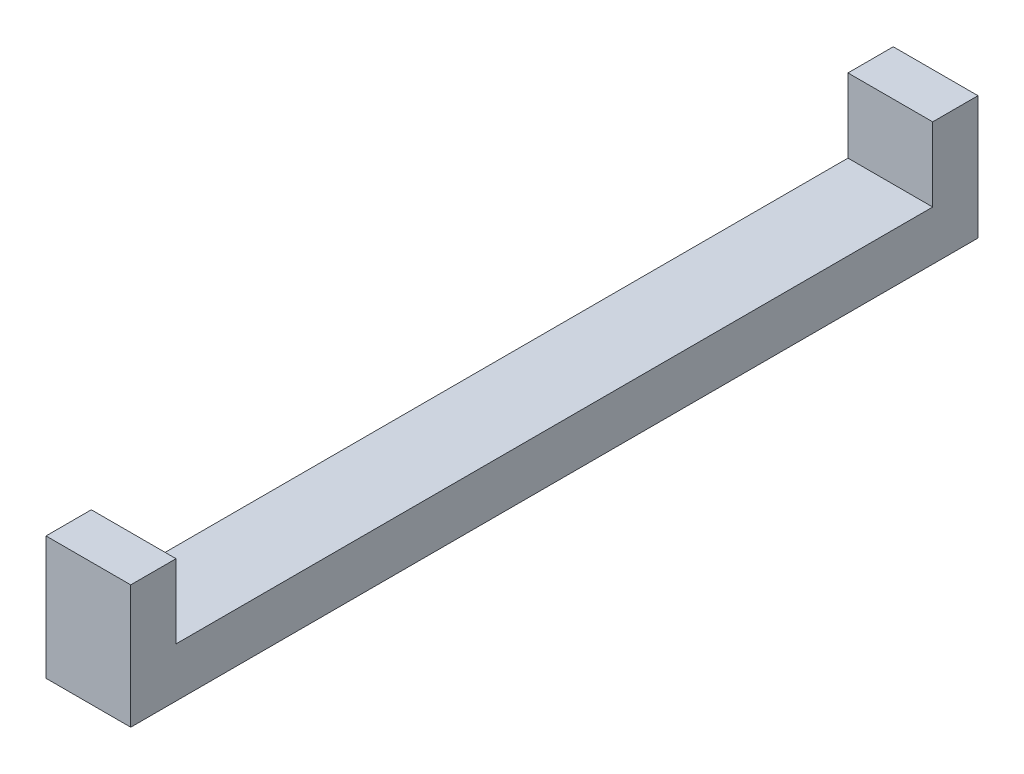
ISO-10303-21;
HEADER;
FILE_DESCRIPTION(('STEP AP214'),'2;1');
FILE_NAME('part.step','',(''),(''),'','','');
FILE_SCHEMA(('AUTOMOTIVE_DESIGN { 1 0 10303 214 1 1 1 1 }'));
ENDSEC;
DATA;
#1=APPLICATION_CONTEXT('core data for automotive mechanical design processes');
#2=APPLICATION_PROTOCOL_DEFINITION('international standard','automotive_design',2000,#1);
#3=PRODUCT_CONTEXT('',#1,'mechanical');
#4=PRODUCT('Part','Part','',(#3));
#5=PRODUCT_RELATED_PRODUCT_CATEGORY('part','',(#4));
#6=PRODUCT_DEFINITION_FORMATION('','',#4);
#7=PRODUCT_DEFINITION_CONTEXT('part definition',#1,'design');
#8=PRODUCT_DEFINITION('design','',#6,#7);
#9=PRODUCT_DEFINITION_SHAPE('','',#8);
#10=(LENGTH_UNIT() NAMED_UNIT(*) SI_UNIT(.MILLI.,.METRE.));
#11=(NAMED_UNIT(*) PLANE_ANGLE_UNIT() SI_UNIT($,.RADIAN.));
#12=(NAMED_UNIT(*) SI_UNIT($,.STERADIAN.) SOLID_ANGLE_UNIT());
#13=UNCERTAINTY_MEASURE_WITH_UNIT(LENGTH_MEASURE(1.E-05),#10,'distance_accuracy_value','');
#14=(GEOMETRIC_REPRESENTATION_CONTEXT(3) GLOBAL_UNCERTAINTY_ASSIGNED_CONTEXT((#13)) GLOBAL_UNIT_ASSIGNED_CONTEXT((#10,
#11,#12)) REPRESENTATION_CONTEXT('',''));
#15=CARTESIAN_POINT('',(0.,0.,0.));
#16=DIRECTION('',(0.,0.,1.));
#17=DIRECTION('',(1.,0.,0.));
#18=AXIS2_PLACEMENT_3D('',#15,#16,#17);
#19=CARTESIAN_POINT('',(5.,0.,50.));
#20=DIRECTION('',(0.,0.,-1.));
#21=DIRECTION('',(-1.,0.,0.));
#22=AXIS2_PLACEMENT_3D('',#19,#20,#21);
#23=PLANE('',#22);
#24=DIRECTION('',(0.,-1.,0.));
#25=VECTOR('',#24,1.);
#26=CARTESIAN_POINT('',(-5.,0.,50.));
#27=LINE('',#26,#25);
#28=CARTESIAN_POINT('',(-5.,14.5558924524075,50.));
#29=VERTEX_POINT('',#28);
#30=CARTESIAN_POINT('',(-5.,0.,50.));
#31=VERTEX_POINT('',#30);
#32=EDGE_CURVE('E140',#29,#31,#27,.T.);
#33=ORIENTED_EDGE('',*,*,#32,.T.);
#34=DIRECTION('',(-1.,0.,0.));
#35=VECTOR('',#34,1.);
#36=CARTESIAN_POINT('',(5.,0.,50.));
#37=LINE('',#36,#35);
#38=CARTESIAN_POINT('',(5.,0.,50.));
#39=VERTEX_POINT('',#38);
#40=EDGE_CURVE('E11',#39,#31,#37,.T.);
#41=ORIENTED_EDGE('',*,*,#40,.F.);
#42=DIRECTION('',(0.,-1.,0.));
#43=VECTOR('',#42,1.);
#44=CARTESIAN_POINT('',(5.,0.,50.));
#45=LINE('',#44,#43);
#46=CARTESIAN_POINT('',(5.,14.5558924524075,50.));
#47=VERTEX_POINT('',#46);
#48=EDGE_CURVE('E162',#47,#39,#45,.T.);
#49=ORIENTED_EDGE('',*,*,#48,.F.);
#50=DIRECTION('',(-1.,0.,0.));
#51=VECTOR('',#50,1.);
#52=CARTESIAN_POINT('',(5.,14.5558924524075,50.));
#53=LINE('',#52,#51);
#54=EDGE_CURVE('E136',#47,#29,#53,.T.);
#55=ORIENTED_EDGE('',*,*,#54,.T.);
#56=EDGE_LOOP('',(#33,#41,#49,#55));
#57=FACE_BOUND('',#56,.T.);
#58=ADVANCED_FACE('F39',(#57),#23,.F.);
#59=CARTESIAN_POINT('',(5.,0.,-50.));
#60=DIRECTION('',(0.,1.,0.));
#61=DIRECTION('',(0.,0.,1.));
#62=AXIS2_PLACEMENT_3D('',#59,#60,#61);
#63=PLANE('',#62);
#64=DIRECTION('',(0.,0.,-1.));
#65=VECTOR('',#64,1.);
#66=CARTESIAN_POINT('',(-5.,0.,-50.));
#67=LINE('',#66,#65);
#68=CARTESIAN_POINT('',(-5.,0.,-50.));
#69=VERTEX_POINT('',#68);
#70=EDGE_CURVE('E144',#31,#69,#67,.T.);
#71=ORIENTED_EDGE('',*,*,#70,.T.);
#72=DIRECTION('',(-1.,0.,0.));
#73=VECTOR('',#72,1.);
#74=CARTESIAN_POINT('',(5.,0.,-50.));
#75=LINE('',#74,#73);
#76=CARTESIAN_POINT('',(5.,0.,-50.));
#77=VERTEX_POINT('',#76);
#78=EDGE_CURVE('E48',#77,#69,#75,.T.);
#79=ORIENTED_EDGE('',*,*,#78,.F.);
#80=DIRECTION('',(0.,0.,-1.));
#81=VECTOR('',#80,1.);
#82=CARTESIAN_POINT('',(5.,0.,-50.));
#83=LINE('',#82,#81);
#84=EDGE_CURVE('E99',#39,#77,#83,.T.);
#85=ORIENTED_EDGE('',*,*,#84,.F.);
#86=ORIENTED_EDGE('',*,*,#40,.T.);
#87=EDGE_LOOP('',(#71,#79,#85,#86));
#88=FACE_BOUND('',#87,.T.);
#89=ADVANCED_FACE('F208',(#88),#63,.F.);
#90=CARTESIAN_POINT('',(5.,0.,-50.));
#91=DIRECTION('',(0.,0.,1.));
#92=DIRECTION('',(1.,0.,0.));
#93=AXIS2_PLACEMENT_3D('',#90,#91,#92);
#94=PLANE('',#93);
#95=DIRECTION('',(0.,1.,0.));
#96=VECTOR('',#95,1.);
#97=CARTESIAN_POINT('',(-5.,0.,-50.));
#98=LINE('',#97,#96);
#99=CARTESIAN_POINT('',(-5.,14.5558924524075,-50.));
#100=VERTEX_POINT('',#99);
#101=EDGE_CURVE('E147',#69,#100,#98,.T.);
#102=ORIENTED_EDGE('',*,*,#101,.T.);
#103=DIRECTION('',(-1.,0.,0.));
#104=VECTOR('',#103,1.);
#105=CARTESIAN_POINT('',(5.,14.5558924524075,-50.));
#106=LINE('',#105,#104);
#107=CARTESIAN_POINT('',(5.,14.5558924524075,-50.));
#108=VERTEX_POINT('',#107);
#109=EDGE_CURVE('E173',#108,#100,#106,.T.);
#110=ORIENTED_EDGE('',*,*,#109,.F.);
#111=DIRECTION('',(0.,1.,0.));
#112=VECTOR('',#111,1.);
#113=CARTESIAN_POINT('',(5.,0.,-50.));
#114=LINE('',#113,#112);
#115=EDGE_CURVE('E183',#77,#108,#114,.T.);
#116=ORIENTED_EDGE('',*,*,#115,.F.);
#117=ORIENTED_EDGE('',*,*,#78,.T.);
#118=EDGE_LOOP('',(#102,#110,#116,#117));
#119=FACE_BOUND('',#118,.T.);
#120=ADVANCED_FACE('F181',(#119),#94,.F.);
#121=CARTESIAN_POINT('',(5.,14.5558924524075,-50.));
#122=DIRECTION('',(0.,-1.,0.));
#123=DIRECTION('',(0.,0.,-1.));
#124=AXIS2_PLACEMENT_3D('',#121,#122,#123);
#125=PLANE('',#124);
#126=DIRECTION('',(0.,0.,1.));
#127=VECTOR('',#126,1.);
#128=CARTESIAN_POINT('',(-5.,14.5558924524075,-50.));
#129=LINE('',#128,#127);
#130=CARTESIAN_POINT('',(-5.,14.5558924524075,-44.6521462677769));
#131=VERTEX_POINT('',#130);
#132=EDGE_CURVE('E150',#100,#131,#129,.T.);
#133=ORIENTED_EDGE('',*,*,#132,.T.);
#134=DIRECTION('',(-1.,0.,0.));
#135=VECTOR('',#134,1.);
#136=CARTESIAN_POINT('',(5.,14.5558924524075,-44.6521462677769));
#137=LINE('',#136,#135);
#138=CARTESIAN_POINT('',(5.,14.5558924524075,-44.6521462677769));
#139=VERTEX_POINT('',#138);
#140=EDGE_CURVE('E169',#139,#131,#137,.T.);
#141=ORIENTED_EDGE('',*,*,#140,.F.);
#142=DIRECTION('',(0.,0.,1.));
#143=VECTOR('',#142,1.);
#144=CARTESIAN_POINT('',(5.,14.5558924524075,-50.));
#145=LINE('',#144,#143);
#146=EDGE_CURVE('E196',#108,#139,#145,.T.);
#147=ORIENTED_EDGE('',*,*,#146,.F.);
#148=ORIENTED_EDGE('',*,*,#109,.T.);
#149=EDGE_LOOP('',(#133,#141,#147,#148));
#150=FACE_BOUND('',#149,.T.);
#151=ADVANCED_FACE('F191',(#150),#125,.F.);
#152=CARTESIAN_POINT('',(5.,14.5558924524075,-44.6521462677769));
#153=DIRECTION('',(0.,0.,-1.));
#154=DIRECTION('',(-1.,0.,0.));
#155=AXIS2_PLACEMENT_3D('',#152,#153,#154);
#156=PLANE('',#155);
#157=DIRECTION('',(0.,-1.,0.));
#158=VECTOR('',#157,1.);
#159=CARTESIAN_POINT('',(-5.,14.5558924524075,-44.6521462677769));
#160=LINE('',#159,#158);
#161=CARTESIAN_POINT('',(-5.,5.84685792132524,-44.6521462677769));
#162=VERTEX_POINT('',#161);
#163=EDGE_CURVE('E153',#131,#162,#160,.T.);
#164=ORIENTED_EDGE('',*,*,#163,.T.);
#165=DIRECTION('',(-1.,0.,0.));
#166=VECTOR('',#165,1.);
#167=CARTESIAN_POINT('',(5.,5.84685792132524,-44.6521462677769));
#168=LINE('',#167,#166);
#169=CARTESIAN_POINT('',(5.,5.84685792132524,-44.6521462677769));
#170=VERTEX_POINT('',#169);
#171=EDGE_CURVE('E129',#170,#162,#168,.T.);
#172=ORIENTED_EDGE('',*,*,#171,.F.);
#173=DIRECTION('',(0.,-1.,0.));
#174=VECTOR('',#173,1.);
#175=CARTESIAN_POINT('',(5.,14.5558924524075,-44.6521462677769));
#176=LINE('',#175,#174);
#177=EDGE_CURVE('E118',#139,#170,#176,.T.);
#178=ORIENTED_EDGE('',*,*,#177,.F.);
#179=ORIENTED_EDGE('',*,*,#140,.T.);
#180=EDGE_LOOP('',(#164,#172,#178,#179));
#181=FACE_BOUND('',#180,.T.);
#182=ADVANCED_FACE('F194',(#181),#156,.F.);
#183=CARTESIAN_POINT('',(5.,5.84685792132523,44.6521462677769));
#184=DIRECTION('',(0.,-1.,0.));
#185=DIRECTION('',(0.,0.,-1.));
#186=AXIS2_PLACEMENT_3D('',#183,#184,#185);
#187=PLANE('',#186);
#188=DIRECTION('',(0.,0.,1.));
#189=VECTOR('',#188,1.);
#190=CARTESIAN_POINT('',(-5.,5.84685792132523,44.6521462677769));
#191=LINE('',#190,#189);
#192=CARTESIAN_POINT('',(-5.,5.84685792132523,44.6521462677769));
#193=VERTEX_POINT('',#192);
#194=EDGE_CURVE('E127',#162,#193,#191,.T.);
#195=ORIENTED_EDGE('',*,*,#194,.T.);
#196=DIRECTION('',(-1.,0.,0.));
#197=VECTOR('',#196,1.);
#198=CARTESIAN_POINT('',(5.,5.84685792132523,44.6521462677769));
#199=LINE('',#198,#197);
#200=CARTESIAN_POINT('',(5.,5.84685792132523,44.6521462677769));
#201=VERTEX_POINT('',#200);
#202=EDGE_CURVE('E124',#201,#193,#199,.T.);
#203=ORIENTED_EDGE('',*,*,#202,.F.);
#204=DIRECTION('',(0.,0.,1.));
#205=VECTOR('',#204,1.);
#206=CARTESIAN_POINT('',(5.,5.84685792132523,44.6521462677769));
#207=LINE('',#206,#205);
#208=EDGE_CURVE('E112',#170,#201,#207,.T.);
#209=ORIENTED_EDGE('',*,*,#208,.F.);
#210=ORIENTED_EDGE('',*,*,#171,.T.);
#211=EDGE_LOOP('',(#195,#203,#209,#210));
#212=FACE_BOUND('',#211,.T.);
#213=ADVANCED_FACE('F125',(#212),#187,.F.);
#214=CARTESIAN_POINT('',(5.,14.5558924524075,44.6521462677769));
#215=DIRECTION('',(0.,0.,1.));
#216=DIRECTION('',(1.,0.,0.));
#217=AXIS2_PLACEMENT_3D('',#214,#215,#216);
#218=PLANE('',#217);
#219=DIRECTION('',(0.,1.,0.));
#220=VECTOR('',#219,1.);
#221=CARTESIAN_POINT('',(-5.,14.5558924524075,44.6521462677769));
#222=LINE('',#221,#220);
#223=CARTESIAN_POINT('',(-5.,14.5558924524075,44.6521462677769));
#224=VERTEX_POINT('',#223);
#225=EDGE_CURVE('E85',#193,#224,#222,.T.);
#226=ORIENTED_EDGE('',*,*,#225,.T.);
#227=DIRECTION('',(-1.,0.,0.));
#228=VECTOR('',#227,1.);
#229=CARTESIAN_POINT('',(5.,14.5558924524075,44.6521462677769));
#230=LINE('',#229,#228);
#231=CARTESIAN_POINT('',(5.,14.5558924524075,44.6521462677769));
#232=VERTEX_POINT('',#231);
#233=EDGE_CURVE('E130',#232,#224,#230,.T.);
#234=ORIENTED_EDGE('',*,*,#233,.F.);
#235=DIRECTION('',(0.,1.,0.));
#236=VECTOR('',#235,1.);
#237=CARTESIAN_POINT('',(5.,14.5558924524075,44.6521462677769));
#238=LINE('',#237,#236);
#239=EDGE_CURVE('E116',#201,#232,#238,.T.);
#240=ORIENTED_EDGE('',*,*,#239,.F.);
#241=ORIENTED_EDGE('',*,*,#202,.T.);
#242=EDGE_LOOP('',(#226,#234,#240,#241));
#243=FACE_BOUND('',#242,.T.);
#244=ADVANCED_FACE('F132',(#243),#218,.F.);
#245=CARTESIAN_POINT('',(5.,14.5558924524075,50.));
#246=DIRECTION('',(0.,-1.,0.));
#247=DIRECTION('',(0.,0.,-1.));
#248=AXIS2_PLACEMENT_3D('',#245,#246,#247);
#249=PLANE('',#248);
#250=DIRECTION('',(0.,0.,1.));
#251=VECTOR('',#250,1.);
#252=CARTESIAN_POINT('',(-5.,14.5558924524075,50.));
#253=LINE('',#252,#251);
#254=EDGE_CURVE('E91',#224,#29,#253,.T.);
#255=ORIENTED_EDGE('',*,*,#254,.T.);
#256=ORIENTED_EDGE('',*,*,#54,.F.);
#257=DIRECTION('',(0.,0.,1.));
#258=VECTOR('',#257,1.);
#259=CARTESIAN_POINT('',(5.,14.5558924524075,50.));
#260=LINE('',#259,#258);
#261=EDGE_CURVE('E56',#232,#47,#260,.T.);
#262=ORIENTED_EDGE('',*,*,#261,.F.);
#263=ORIENTED_EDGE('',*,*,#233,.T.);
#264=EDGE_LOOP('',(#255,#256,#262,#263));
#265=FACE_BOUND('',#264,.T.);
#266=ADVANCED_FACE('F224',(#265),#249,.F.);
#267=CARTESIAN_POINT('',(5.,0.,0.));
#268=DIRECTION('',(-1.,0.,0.));
#269=DIRECTION('',(0.,0.,1.));
#270=AXIS2_PLACEMENT_3D('',#267,#268,#269);
#271=PLANE('',#270);
#272=ORIENTED_EDGE('',*,*,#48,.T.);
#273=ORIENTED_EDGE('',*,*,#84,.T.);
#274=ORIENTED_EDGE('',*,*,#115,.T.);
#275=ORIENTED_EDGE('',*,*,#146,.T.);
#276=ORIENTED_EDGE('',*,*,#177,.T.);
#277=ORIENTED_EDGE('',*,*,#208,.T.);
#278=ORIENTED_EDGE('',*,*,#239,.T.);
#279=ORIENTED_EDGE('',*,*,#261,.T.);
#280=EDGE_LOOP('',(#272,#273,#274,#275,#276,#277,#278,#279));
#281=FACE_BOUND('',#280,.T.);
#282=ADVANCED_FACE('F114',(#281),#271,.F.);
#283=CARTESIAN_POINT('',(-5.,0.,0.));
#284=DIRECTION('',(-1.,0.,0.));
#285=DIRECTION('',(0.,0.,1.));
#286=AXIS2_PLACEMENT_3D('',#283,#284,#285);
#287=PLANE('',#286);
#288=ORIENTED_EDGE('',*,*,#32,.F.);
#289=ORIENTED_EDGE('',*,*,#254,.F.);
#290=ORIENTED_EDGE('',*,*,#225,.F.);
#291=ORIENTED_EDGE('',*,*,#194,.F.);
#292=ORIENTED_EDGE('',*,*,#163,.F.);
#293=ORIENTED_EDGE('',*,*,#132,.F.);
#294=ORIENTED_EDGE('',*,*,#101,.F.);
#295=ORIENTED_EDGE('',*,*,#70,.F.);
#296=EDGE_LOOP('',(#288,#289,#290,#291,#292,#293,#294,#295));
#297=FACE_BOUND('',#296,.T.);
#298=ADVANCED_FACE('F187',(#297),#287,.T.);
#299=CLOSED_SHELL('',(#58,#89,#120,#151,#182,#213,#244,#266,#282,#298));
#300=MANIFOLD_SOLID_BREP('B2',#299);
#301=ADVANCED_BREP_SHAPE_REPRESENTATION('',(#18,#300),#14);
#302=SHAPE_DEFINITION_REPRESENTATION(#9,#301);
ENDSEC;
END-ISO-10303-21;
